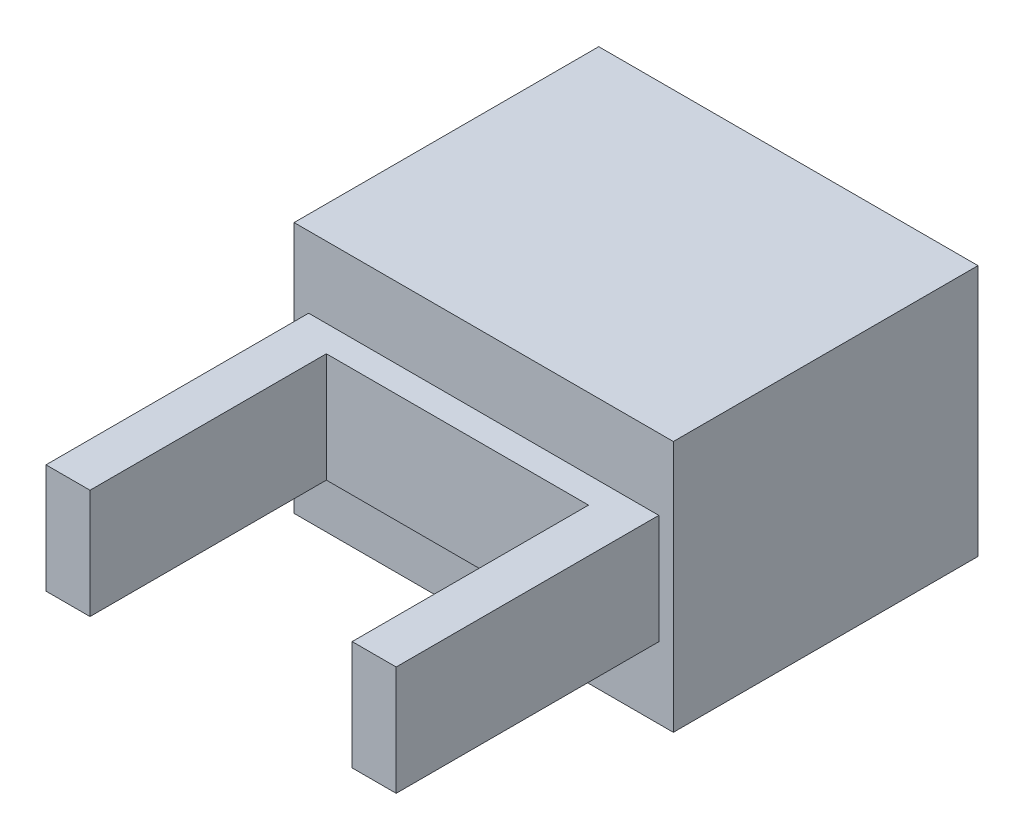
ISO-10303-21;
HEADER;
FILE_DESCRIPTION(('STEP AP214'),'2;1');
FILE_NAME('part.step','',(''),(''),'','','');
FILE_SCHEMA(('AUTOMOTIVE_DESIGN { 1 0 10303 214 1 1 1 1 }'));
ENDSEC;
DATA;
#1=APPLICATION_CONTEXT('core data for automotive mechanical design processes');
#2=APPLICATION_PROTOCOL_DEFINITION('international standard','automotive_design',2000,#1);
#3=PRODUCT_CONTEXT('',#1,'mechanical');
#4=PRODUCT('Part','Part','',(#3));
#5=PRODUCT_RELATED_PRODUCT_CATEGORY('part','',(#4));
#6=PRODUCT_DEFINITION_FORMATION('','',#4);
#7=PRODUCT_DEFINITION_CONTEXT('part definition',#1,'design');
#8=PRODUCT_DEFINITION('design','',#6,#7);
#9=PRODUCT_DEFINITION_SHAPE('','',#8);
#10=(LENGTH_UNIT() NAMED_UNIT(*) SI_UNIT(.MILLI.,.METRE.));
#11=(NAMED_UNIT(*) PLANE_ANGLE_UNIT() SI_UNIT($,.RADIAN.));
#12=(NAMED_UNIT(*) SI_UNIT($,.STERADIAN.) SOLID_ANGLE_UNIT());
#13=UNCERTAINTY_MEASURE_WITH_UNIT(LENGTH_MEASURE(1.E-05),#10,'distance_accuracy_value','');
#14=(GEOMETRIC_REPRESENTATION_CONTEXT(3) GLOBAL_UNCERTAINTY_ASSIGNED_CONTEXT((#13)) GLOBAL_UNIT_ASSIGNED_CONTEXT((#10,
#11,#12)) REPRESENTATION_CONTEXT('',''));
#15=CARTESIAN_POINT('',(0.,0.,0.));
#16=DIRECTION('',(0.,0.,1.));
#17=DIRECTION('',(1.,0.,0.));
#18=AXIS2_PLACEMENT_3D('',#15,#16,#17);
#19=CARTESIAN_POINT('',(0.,0.,76.2));
#20=DIRECTION('',(0.,0.,1.));
#21=DIRECTION('',(1.,0.,0.));
#22=AXIS2_PLACEMENT_3D('',#19,#20,#21);
#23=PLANE('',#22);
#24=DIRECTION('',(0.,-1.,0.));
#25=VECTOR('',#24,1.);
#26=CARTESIAN_POINT('',(-38.0320352694788,-15.875,76.2));
#27=LINE('',#26,#25);
#28=CARTESIAN_POINT('',(-38.0320352694788,15.875,76.2));
#29=VERTEX_POINT('',#28);
#30=CARTESIAN_POINT('',(-38.0320352694788,-15.875,76.2));
#31=VERTEX_POINT('',#30);
#32=EDGE_CURVE('E169',#29,#31,#27,.T.);
#33=ORIENTED_EDGE('',*,*,#32,.F.);
#34=DIRECTION('',(-1.,0.,0.));
#35=VECTOR('',#34,1.);
#36=CARTESIAN_POINT('',(50.8,15.875,76.2));
#37=LINE('',#36,#35);
#38=CARTESIAN_POINT('',(-50.8,15.875,76.2));
#39=VERTEX_POINT('',#38);
#40=EDGE_CURVE('E63',#29,#39,#37,.T.);
#41=ORIENTED_EDGE('',*,*,#40,.T.);
#42=DIRECTION('',(0.,-1.,0.));
#43=VECTOR('',#42,1.);
#44=CARTESIAN_POINT('',(-50.8,-15.875,76.2));
#45=LINE('',#44,#43);
#46=CARTESIAN_POINT('',(-50.8,-15.875,76.2));
#47=VERTEX_POINT('',#46);
#48=EDGE_CURVE('E107',#39,#47,#45,.T.);
#49=ORIENTED_EDGE('',*,*,#48,.T.);
#50=DIRECTION('',(1.,0.,0.));
#51=VECTOR('',#50,1.);
#52=CARTESIAN_POINT('',(50.8,-15.875,76.2));
#53=LINE('',#52,#51);
#54=EDGE_CURVE('E106',#47,#31,#53,.T.);
#55=ORIENTED_EDGE('',*,*,#54,.T.);
#56=EDGE_LOOP('',(#33,#41,#49,#55));
#57=FACE_BOUND('',#56,.T.);
#58=ADVANCED_FACE('F39',(#57),#23,.T.);
#59=CARTESIAN_POINT('',(-50.8,-15.875,76.2));
#60=DIRECTION('',(1.,0.,0.));
#61=DIRECTION('',(0.,0.,-1.));
#62=AXIS2_PLACEMENT_3D('',#59,#60,#61);
#63=PLANE('',#62);
#64=DIRECTION('',(0.,-1.,0.));
#65=VECTOR('',#64,1.);
#66=CARTESIAN_POINT('',(-50.8,-15.875,0.));
#67=LINE('',#66,#65);
#68=CARTESIAN_POINT('',(-50.8,15.875,0.));
#69=VERTEX_POINT('',#68);
#70=CARTESIAN_POINT('',(-50.8,-15.875,0.));
#71=VERTEX_POINT('',#70);
#72=EDGE_CURVE('E125',#69,#71,#67,.T.);
#73=ORIENTED_EDGE('',*,*,#72,.T.);
#74=DIRECTION('',(0.,0.,-1.));
#75=VECTOR('',#74,1.);
#76=CARTESIAN_POINT('',(-50.8,-15.875,76.2));
#77=LINE('',#76,#75);
#78=EDGE_CURVE('E12',#47,#71,#77,.T.);
#79=ORIENTED_EDGE('',*,*,#78,.F.);
#80=ORIENTED_EDGE('',*,*,#48,.F.);
#81=DIRECTION('',(0.,0.,-1.));
#82=VECTOR('',#81,1.);
#83=CARTESIAN_POINT('',(-50.8,15.875,76.2));
#84=LINE('',#83,#82);
#85=EDGE_CURVE('E124',#39,#69,#84,.T.);
#86=ORIENTED_EDGE('',*,*,#85,.T.);
#87=EDGE_LOOP('',(#73,#79,#80,#86));
#88=FACE_BOUND('',#87,.T.);
#89=ADVANCED_FACE('F41',(#88),#63,.F.);
#90=CARTESIAN_POINT('',(50.8,-15.875,76.2));
#91=DIRECTION('',(0.,1.,0.));
#92=DIRECTION('',(-1.,0.,0.));
#93=AXIS2_PLACEMENT_3D('',#90,#91,#92);
#94=PLANE('',#93);
#95=DIRECTION('',(-1.,0.,0.));
#96=VECTOR('',#95,1.);
#97=CARTESIAN_POINT('',(38.0320352694788,-15.875,7.62));
#98=LINE('',#97,#96);
#99=CARTESIAN_POINT('',(38.0320352694788,-15.875,7.62));
#100=VERTEX_POINT('',#99);
#101=CARTESIAN_POINT('',(-38.0320352694788,-15.875,7.62));
#102=VERTEX_POINT('',#101);
#103=EDGE_CURVE('E128',#100,#102,#98,.T.);
#104=ORIENTED_EDGE('',*,*,#103,.T.);
#105=DIRECTION('',(0.,0.,1.));
#106=VECTOR('',#105,1.);
#107=CARTESIAN_POINT('',(-38.0320352694788,-15.875,-82.4245432317069));
#108=LINE('',#107,#106);
#109=EDGE_CURVE('E167',#102,#31,#108,.T.);
#110=ORIENTED_EDGE('',*,*,#109,.T.);
#111=ORIENTED_EDGE('',*,*,#54,.F.);
#112=ORIENTED_EDGE('',*,*,#78,.T.);
#113=DIRECTION('',(1.,0.,0.));
#114=VECTOR('',#113,1.);
#115=CARTESIAN_POINT('',(50.8,-15.875,0.));
#116=LINE('',#115,#114);
#117=CARTESIAN_POINT('',(50.8,-15.875,0.));
#118=VERTEX_POINT('',#117);
#119=EDGE_CURVE('E112',#71,#118,#116,.T.);
#120=ORIENTED_EDGE('',*,*,#119,.T.);
#121=DIRECTION('',(0.,0.,-1.));
#122=VECTOR('',#121,1.);
#123=CARTESIAN_POINT('',(50.8,-15.875,76.2));
#124=LINE('',#123,#122);
#125=CARTESIAN_POINT('',(50.8,-15.875,76.2));
#126=VERTEX_POINT('',#125);
#127=EDGE_CURVE('E47',#126,#118,#124,.T.);
#128=ORIENTED_EDGE('',*,*,#127,.F.);
#129=CARTESIAN_POINT('',(38.0320352694788,-15.875,76.2));
#130=VERTEX_POINT('',#129);
#131=EDGE_CURVE('E97',#130,#126,#53,.T.);
#132=ORIENTED_EDGE('',*,*,#131,.F.);
#133=DIRECTION('',(0.,0.,1.));
#134=VECTOR('',#133,1.);
#135=CARTESIAN_POINT('',(38.0320352694788,-15.875,-82.4245432317069));
#136=LINE('',#135,#134);
#137=EDGE_CURVE('E54',#100,#130,#136,.T.);
#138=ORIENTED_EDGE('',*,*,#137,.F.);
#139=EDGE_LOOP('',(#104,#110,#111,#112,#120,#128,#132,#138));
#140=FACE_BOUND('',#139,.T.);
#141=ADVANCED_FACE('F111',(#140),#94,.F.);
#142=CARTESIAN_POINT('',(50.8,-15.875,76.2));
#143=DIRECTION('',(-1.,0.,0.));
#144=DIRECTION('',(0.,0.,1.));
#145=AXIS2_PLACEMENT_3D('',#142,#143,#144);
#146=PLANE('',#145);
#147=DIRECTION('',(0.,1.,0.));
#148=VECTOR('',#147,1.);
#149=CARTESIAN_POINT('',(50.8,-15.875,0.));
#150=LINE('',#149,#148);
#151=CARTESIAN_POINT('',(50.8,15.875,0.));
#152=VERTEX_POINT('',#151);
#153=EDGE_CURVE('E77',#118,#152,#150,.T.);
#154=ORIENTED_EDGE('',*,*,#153,.T.);
#155=DIRECTION('',(0.,0.,-1.));
#156=VECTOR('',#155,1.);
#157=CARTESIAN_POINT('',(50.8,15.875,76.2));
#158=LINE('',#157,#156);
#159=CARTESIAN_POINT('',(50.8,15.875,76.2));
#160=VERTEX_POINT('',#159);
#161=EDGE_CURVE('E114',#160,#152,#158,.T.);
#162=ORIENTED_EDGE('',*,*,#161,.F.);
#163=DIRECTION('',(0.,1.,0.));
#164=VECTOR('',#163,1.);
#165=CARTESIAN_POINT('',(50.8,-15.875,76.2));
#166=LINE('',#165,#164);
#167=EDGE_CURVE('E102',#126,#160,#166,.T.);
#168=ORIENTED_EDGE('',*,*,#167,.F.);
#169=ORIENTED_EDGE('',*,*,#127,.T.);
#170=EDGE_LOOP('',(#154,#162,#168,#169));
#171=FACE_BOUND('',#170,.T.);
#172=ADVANCED_FACE('F115',(#171),#146,.F.);
#173=CARTESIAN_POINT('',(50.8,15.875,76.2));
#174=DIRECTION('',(0.,-1.,0.));
#175=DIRECTION('',(1.,0.,0.));
#176=AXIS2_PLACEMENT_3D('',#173,#174,#175);
#177=PLANE('',#176);
#178=ORIENTED_EDGE('',*,*,#40,.F.);
#179=DIRECTION('',(0.,0.,1.));
#180=VECTOR('',#179,1.);
#181=CARTESIAN_POINT('',(-38.0320352694788,15.875,-82.4245432317069));
#182=LINE('',#181,#180);
#183=CARTESIAN_POINT('',(-38.0320352694788,15.875,7.62));
#184=VERTEX_POINT('',#183);
#185=EDGE_CURVE('E228',#184,#29,#182,.T.);
#186=ORIENTED_EDGE('',*,*,#185,.F.);
#187=DIRECTION('',(1.,0.,0.));
#188=VECTOR('',#187,1.);
#189=CARTESIAN_POINT('',(38.0320352694788,15.875,7.62));
#190=LINE('',#189,#188);
#191=CARTESIAN_POINT('',(38.0320352694788,15.875,7.62));
#192=VERTEX_POINT('',#191);
#193=EDGE_CURVE('E162',#184,#192,#190,.T.);
#194=ORIENTED_EDGE('',*,*,#193,.T.);
#195=DIRECTION('',(0.,0.,1.));
#196=VECTOR('',#195,1.);
#197=CARTESIAN_POINT('',(38.0320352694788,15.875,-82.4245432317069));
#198=LINE('',#197,#196);
#199=CARTESIAN_POINT('',(38.0320352694788,15.875,76.2));
#200=VERTEX_POINT('',#199);
#201=EDGE_CURVE('E233',#192,#200,#198,.T.);
#202=ORIENTED_EDGE('',*,*,#201,.T.);
#203=EDGE_CURVE('E119',#160,#200,#37,.T.);
#204=ORIENTED_EDGE('',*,*,#203,.F.);
#205=ORIENTED_EDGE('',*,*,#161,.T.);
#206=DIRECTION('',(-1.,0.,0.));
#207=VECTOR('',#206,1.);
#208=CARTESIAN_POINT('',(50.8,15.875,0.));
#209=LINE('',#208,#207);
#210=EDGE_CURVE('E131',#152,#69,#209,.T.);
#211=ORIENTED_EDGE('',*,*,#210,.T.);
#212=ORIENTED_EDGE('',*,*,#85,.F.);
#213=EDGE_LOOP('',(#178,#186,#194,#202,#204,#205,#211,#212));
#214=FACE_BOUND('',#213,.T.);
#215=ADVANCED_FACE('F138',(#214),#177,.F.);
#216=DIRECTION('',(0.,1.,0.));
#217=VECTOR('',#216,1.);
#218=CARTESIAN_POINT('',(38.0320352694788,-15.875,76.2));
#219=LINE('',#218,#217);
#220=EDGE_CURVE('E104',#130,#200,#219,.T.);
#221=ORIENTED_EDGE('',*,*,#220,.F.);
#222=ORIENTED_EDGE('',*,*,#131,.T.);
#223=ORIENTED_EDGE('',*,*,#167,.T.);
#224=ORIENTED_EDGE('',*,*,#203,.T.);
#225=EDGE_LOOP('',(#221,#222,#223,#224));
#226=FACE_BOUND('',#225,.T.);
#227=ADVANCED_FACE('F99',(#226),#23,.T.);
#228=CARTESIAN_POINT('',(-38.0320352694788,-15.875,-82.4245432317069));
#229=DIRECTION('',(-1.,0.,0.));
#230=DIRECTION('',(0.,0.,1.));
#231=AXIS2_PLACEMENT_3D('',#228,#229,#230);
#232=PLANE('',#231);
#233=DIRECTION('',(0.,1.,0.));
#234=VECTOR('',#233,1.);
#235=CARTESIAN_POINT('',(-38.0320352694788,-15.875,7.62));
#236=LINE('',#235,#234);
#237=EDGE_CURVE('E158',#102,#184,#236,.T.);
#238=ORIENTED_EDGE('',*,*,#237,.T.);
#239=ORIENTED_EDGE('',*,*,#185,.T.);
#240=ORIENTED_EDGE('',*,*,#32,.T.);
#241=ORIENTED_EDGE('',*,*,#109,.F.);
#242=EDGE_LOOP('',(#238,#239,#240,#241));
#243=FACE_BOUND('',#242,.T.);
#244=ADVANCED_FACE('F168',(#243),#232,.F.);
#245=CARTESIAN_POINT('',(38.0320352694788,-15.875,-82.4245432317069));
#246=DIRECTION('',(1.,0.,0.));
#247=DIRECTION('',(0.,0.,-1.));
#248=AXIS2_PLACEMENT_3D('',#245,#246,#247);
#249=PLANE('',#248);
#250=DIRECTION('',(0.,-1.,0.));
#251=VECTOR('',#250,1.);
#252=CARTESIAN_POINT('',(38.0320352694788,-15.875,7.62));
#253=LINE('',#252,#251);
#254=EDGE_CURVE('E87',#192,#100,#253,.T.);
#255=ORIENTED_EDGE('',*,*,#254,.T.);
#256=ORIENTED_EDGE('',*,*,#137,.T.);
#257=ORIENTED_EDGE('',*,*,#220,.T.);
#258=ORIENTED_EDGE('',*,*,#201,.F.);
#259=EDGE_LOOP('',(#255,#256,#257,#258));
#260=FACE_BOUND('',#259,.T.);
#261=ADVANCED_FACE('F234',(#260),#249,.F.);
#262=CARTESIAN_POINT('',(0.,0.,7.62));
#263=DIRECTION('',(0.,0.,1.));
#264=DIRECTION('',(1.,0.,0.));
#265=AXIS2_PLACEMENT_3D('',#262,#263,#264);
#266=PLANE('',#265);
#267=ORIENTED_EDGE('',*,*,#237,.F.);
#268=ORIENTED_EDGE('',*,*,#103,.F.);
#269=ORIENTED_EDGE('',*,*,#254,.F.);
#270=ORIENTED_EDGE('',*,*,#193,.F.);
#271=EDGE_LOOP('',(#267,#268,#269,#270));
#272=FACE_BOUND('',#271,.T.);
#273=ADVANCED_FACE('F160',(#272),#266,.T.);
#274=CARTESIAN_POINT('',(-55.0180205205532,-36.5405829059701,-88.392));
#275=DIRECTION('',(1.,0.,0.));
#276=DIRECTION('',(0.,0.,-1.));
#277=AXIS2_PLACEMENT_3D('',#274,#275,#276);
#278=PLANE('',#277);
#279=DIRECTION('',(0.,1.,0.));
#280=VECTOR('',#279,1.);
#281=CARTESIAN_POINT('',(-55.0180205205532,-36.5405829059701,0.));
#282=LINE('',#281,#280);
#283=CARTESIAN_POINT('',(-55.0180205205532,-36.5405829059701,0.));
#284=VERTEX_POINT('',#283);
#285=CARTESIAN_POINT('',(-55.0180205205532,36.5405829059701,0.));
#286=VERTEX_POINT('',#285);
#287=EDGE_CURVE('E186',#284,#286,#282,.T.);
#288=ORIENTED_EDGE('',*,*,#287,.T.);
#289=DIRECTION('',(0.,0.,1.));
#290=VECTOR('',#289,1.);
#291=CARTESIAN_POINT('',(-55.0180205205532,36.5405829059701,-88.392));
#292=LINE('',#291,#290);
#293=CARTESIAN_POINT('',(-55.0180205205532,36.5405829059701,-88.392));
#294=VERTEX_POINT('',#293);
#295=EDGE_CURVE('E225',#294,#286,#292,.T.);
#296=ORIENTED_EDGE('',*,*,#295,.F.);
#297=DIRECTION('',(0.,1.,0.));
#298=VECTOR('',#297,1.);
#299=CARTESIAN_POINT('',(-55.0180205205532,-36.5405829059701,-88.392));
#300=LINE('',#299,#298);
#301=CARTESIAN_POINT('',(-55.0180205205532,-36.5405829059701,-88.392));
#302=VERTEX_POINT('',#301);
#303=EDGE_CURVE('E210',#302,#294,#300,.T.);
#304=ORIENTED_EDGE('',*,*,#303,.F.);
#305=DIRECTION('',(0.,0.,1.));
#306=VECTOR('',#305,1.);
#307=CARTESIAN_POINT('',(-55.0180205205532,-36.5405829059701,-88.392));
#308=LINE('',#307,#306);
#309=EDGE_CURVE('E205',#302,#284,#308,.T.);
#310=ORIENTED_EDGE('',*,*,#309,.T.);
#311=EDGE_LOOP('',(#288,#296,#304,#310));
#312=FACE_BOUND('',#311,.T.);
#313=ADVANCED_FACE('F241',(#312),#278,.F.);
#314=CARTESIAN_POINT('',(-55.0180205205532,36.5405829059701,-88.392));
#315=DIRECTION('',(0.,-1.,0.));
#316=DIRECTION('',(0.,0.,-1.));
#317=AXIS2_PLACEMENT_3D('',#314,#315,#316);
#318=PLANE('',#317);
#319=DIRECTION('',(1.,0.,0.));
#320=VECTOR('',#319,1.);
#321=CARTESIAN_POINT('',(-55.0180205205532,36.5405829059701,0.));
#322=LINE('',#321,#320);
#323=CARTESIAN_POINT('',(55.0180205205532,36.5405829059701,0.));
#324=VERTEX_POINT('',#323);
#325=EDGE_CURVE('E193',#286,#324,#322,.T.);
#326=ORIENTED_EDGE('',*,*,#325,.T.);
#327=DIRECTION('',(0.,0.,1.));
#328=VECTOR('',#327,1.);
#329=CARTESIAN_POINT('',(55.0180205205532,36.5405829059701,-88.392));
#330=LINE('',#329,#328);
#331=CARTESIAN_POINT('',(55.0180205205532,36.5405829059701,-88.392));
#332=VERTEX_POINT('',#331);
#333=EDGE_CURVE('E222',#332,#324,#330,.T.);
#334=ORIENTED_EDGE('',*,*,#333,.F.);
#335=DIRECTION('',(1.,0.,0.));
#336=VECTOR('',#335,1.);
#337=CARTESIAN_POINT('',(-55.0180205205532,36.5405829059701,-88.392));
#338=LINE('',#337,#336);
#339=EDGE_CURVE('E214',#294,#332,#338,.T.);
#340=ORIENTED_EDGE('',*,*,#339,.F.);
#341=ORIENTED_EDGE('',*,*,#295,.T.);
#342=EDGE_LOOP('',(#326,#334,#340,#341));
#343=FACE_BOUND('',#342,.T.);
#344=ADVANCED_FACE('F303',(#343),#318,.F.);
#345=CARTESIAN_POINT('',(55.0180205205532,-36.5405829059701,-88.392));
#346=DIRECTION('',(1.,0.,0.));
#347=DIRECTION('',(0.,0.,-1.));
#348=AXIS2_PLACEMENT_3D('',#345,#346,#347);
#349=PLANE('',#348);
#350=DIRECTION('',(0.,1.,0.));
#351=VECTOR('',#350,1.);
#352=CARTESIAN_POINT('',(55.0180205205532,-36.5405829059701,0.));
#353=LINE('',#352,#351);
#354=CARTESIAN_POINT('',(55.0180205205532,-36.5405829059701,0.));
#355=VERTEX_POINT('',#354);
#356=EDGE_CURVE('E211',#355,#324,#353,.T.);
#357=ORIENTED_EDGE('',*,*,#356,.F.);
#358=DIRECTION('',(0.,0.,1.));
#359=VECTOR('',#358,1.);
#360=CARTESIAN_POINT('',(55.0180205205532,-36.5405829059701,-88.392));
#361=LINE('',#360,#359);
#362=CARTESIAN_POINT('',(55.0180205205532,-36.5405829059701,-88.392));
#363=VERTEX_POINT('',#362);
#364=EDGE_CURVE('E208',#363,#355,#361,.T.);
#365=ORIENTED_EDGE('',*,*,#364,.F.);
#366=DIRECTION('',(0.,1.,0.));
#367=VECTOR('',#366,1.);
#368=CARTESIAN_POINT('',(55.0180205205532,-36.5405829059701,-88.392));
#369=LINE('',#368,#367);
#370=EDGE_CURVE('E365',#363,#332,#369,.T.);
#371=ORIENTED_EDGE('',*,*,#370,.T.);
#372=ORIENTED_EDGE('',*,*,#333,.T.);
#373=EDGE_LOOP('',(#357,#365,#371,#372));
#374=FACE_BOUND('',#373,.T.);
#375=ADVANCED_FACE('F311',(#374),#349,.T.);
#376=CARTESIAN_POINT('',(-55.0180205205532,-36.5405829059701,-88.392));
#377=DIRECTION('',(0.,-1.,0.));
#378=DIRECTION('',(0.,0.,-1.));
#379=AXIS2_PLACEMENT_3D('',#376,#377,#378);
#380=PLANE('',#379);
#381=DIRECTION('',(1.,0.,0.));
#382=VECTOR('',#381,1.);
#383=CARTESIAN_POINT('',(-55.0180205205532,-36.5405829059701,0.));
#384=LINE('',#383,#382);
#385=EDGE_CURVE('E190',#284,#355,#384,.T.);
#386=ORIENTED_EDGE('',*,*,#385,.F.);
#387=ORIENTED_EDGE('',*,*,#309,.F.);
#388=DIRECTION('',(1.,0.,0.));
#389=VECTOR('',#388,1.);
#390=CARTESIAN_POINT('',(-55.0180205205532,-36.5405829059701,-88.392));
#391=LINE('',#390,#389);
#392=EDGE_CURVE('E220',#302,#363,#391,.T.);
#393=ORIENTED_EDGE('',*,*,#392,.T.);
#394=ORIENTED_EDGE('',*,*,#364,.T.);
#395=EDGE_LOOP('',(#386,#387,#393,#394));
#396=FACE_BOUND('',#395,.T.);
#397=ADVANCED_FACE('F203',(#396),#380,.T.);
#398=CARTESIAN_POINT('',(0.,0.,-88.392));
#399=DIRECTION('',(0.,0.,-1.));
#400=DIRECTION('',(-1.,0.,0.));
#401=AXIS2_PLACEMENT_3D('',#398,#399,#400);
#402=PLANE('',#401);
#403=ORIENTED_EDGE('',*,*,#303,.T.);
#404=ORIENTED_EDGE('',*,*,#339,.T.);
#405=ORIENTED_EDGE('',*,*,#370,.F.);
#406=ORIENTED_EDGE('',*,*,#392,.F.);
#407=EDGE_LOOP('',(#403,#404,#405,#406));
#408=FACE_BOUND('',#407,.T.);
#409=ADVANCED_FACE('F179',(#408),#402,.T.);
#410=CARTESIAN_POINT('',(0.,0.,0.));
#411=DIRECTION('',(0.,0.,-1.));
#412=DIRECTION('',(-1.,0.,0.));
#413=AXIS2_PLACEMENT_3D('',#410,#411,#412);
#414=PLANE('',#413);
#415=ORIENTED_EDGE('',*,*,#72,.F.);
#416=ORIENTED_EDGE('',*,*,#210,.F.);
#417=ORIENTED_EDGE('',*,*,#153,.F.);
#418=ORIENTED_EDGE('',*,*,#119,.F.);
#419=EDGE_LOOP('',(#415,#416,#417,#418));
#420=FACE_BOUND('',#419,.T.);
#421=ORIENTED_EDGE('',*,*,#287,.F.);
#422=ORIENTED_EDGE('',*,*,#385,.T.);
#423=ORIENTED_EDGE('',*,*,#356,.T.);
#424=ORIENTED_EDGE('',*,*,#325,.F.);
#425=EDGE_LOOP('',(#421,#422,#423,#424));
#426=FACE_BOUND('',#425,.T.);
#427=ADVANCED_FACE('F176',(#420,#426),#414,.F.);
#428=CLOSED_SHELL('',(#58,#89,#141,#172,#215,#227,#244,#261,#273,#313,#344,#375,#397,#409,#427));
#429=MANIFOLD_SOLID_BREP('B2',#428);
#430=ADVANCED_BREP_SHAPE_REPRESENTATION('',(#18,#429),#14);
#431=SHAPE_DEFINITION_REPRESENTATION(#9,#430);
ENDSEC;
END-ISO-10303-21;
